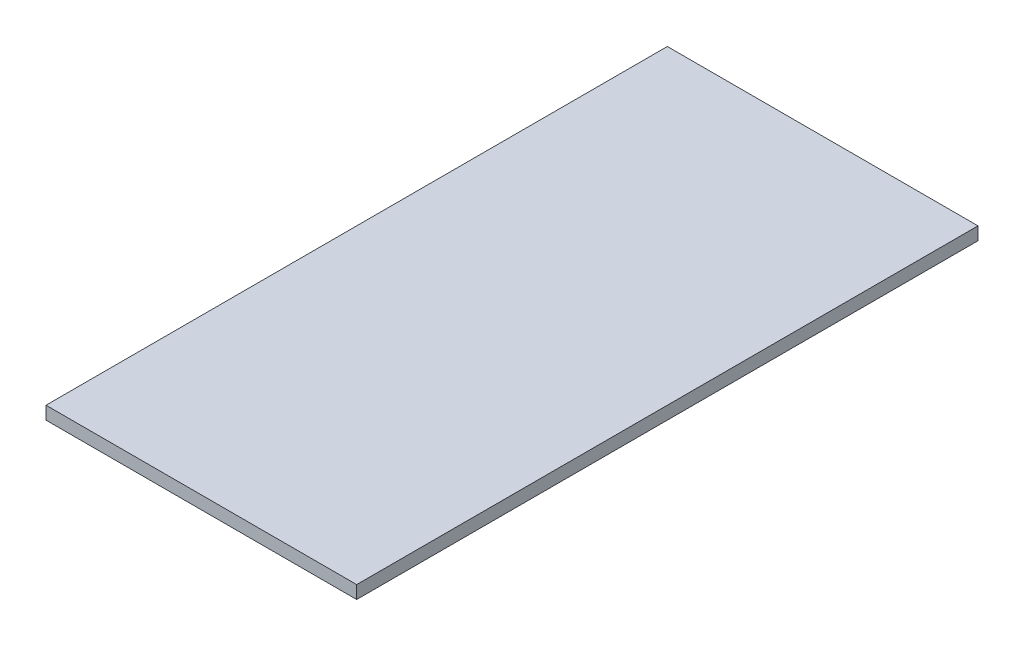
ISO-10303-21;
HEADER;
FILE_DESCRIPTION(('STEP AP214'),'2;1');
FILE_NAME('part.step','',(''),(''),'','','');
FILE_SCHEMA(('AUTOMOTIVE_DESIGN { 1 0 10303 214 1 1 1 1 }'));
ENDSEC;
DATA;
#1=APPLICATION_CONTEXT('core data for automotive mechanical design processes');
#2=APPLICATION_PROTOCOL_DEFINITION('international standard','automotive_design',2000,#1);
#3=PRODUCT_CONTEXT('',#1,'mechanical');
#4=PRODUCT('Part','Part','',(#3));
#5=PRODUCT_RELATED_PRODUCT_CATEGORY('part','',(#4));
#6=PRODUCT_DEFINITION_FORMATION('','',#4);
#7=PRODUCT_DEFINITION_CONTEXT('part definition',#1,'design');
#8=PRODUCT_DEFINITION('design','',#6,#7);
#9=PRODUCT_DEFINITION_SHAPE('','',#8);
#10=(LENGTH_UNIT() NAMED_UNIT(*) SI_UNIT(.MILLI.,.METRE.));
#11=(NAMED_UNIT(*) PLANE_ANGLE_UNIT() SI_UNIT($,.RADIAN.));
#12=(NAMED_UNIT(*) SI_UNIT($,.STERADIAN.) SOLID_ANGLE_UNIT());
#13=UNCERTAINTY_MEASURE_WITH_UNIT(LENGTH_MEASURE(1.E-05),#10,'distance_accuracy_value','');
#14=(GEOMETRIC_REPRESENTATION_CONTEXT(3) GLOBAL_UNCERTAINTY_ASSIGNED_CONTEXT((#13)) GLOBAL_UNIT_ASSIGNED_CONTEXT((#10,
#11,#12)) REPRESENTATION_CONTEXT('',''));
#15=CARTESIAN_POINT('',(0.,0.,0.));
#16=DIRECTION('',(0.,0.,1.));
#17=DIRECTION('',(1.,0.,0.));
#18=AXIS2_PLACEMENT_3D('',#15,#16,#17);
#19=CARTESIAN_POINT('',(0.,3.175,0.));
#20=DIRECTION('',(1.,0.,0.));
#21=DIRECTION('',(0.,0.,-1.));
#22=AXIS2_PLACEMENT_3D('',#19,#20,#21);
#23=PLANE('',#22);
#24=DIRECTION('',(0.,0.,1.));
#25=VECTOR('',#24,1.);
#26=CARTESIAN_POINT('',(0.,0.,0.));
#27=LINE('',#26,#25);
#28=CARTESIAN_POINT('',(0.,0.,-152.4));
#29=VERTEX_POINT('',#28);
#30=CARTESIAN_POINT('',(0.,0.,0.));
#31=VERTEX_POINT('',#30);
#32=EDGE_CURVE('E98',#29,#31,#27,.T.);
#33=ORIENTED_EDGE('',*,*,#32,.T.);
#34=DIRECTION('',(0.,-1.,0.));
#35=VECTOR('',#34,1.);
#36=CARTESIAN_POINT('',(0.,3.175,0.));
#37=LINE('',#36,#35);
#38=CARTESIAN_POINT('',(0.,3.175,0.));
#39=VERTEX_POINT('',#38);
#40=EDGE_CURVE('E11',#39,#31,#37,.T.);
#41=ORIENTED_EDGE('',*,*,#40,.F.);
#42=DIRECTION('',(0.,0.,1.));
#43=VECTOR('',#42,1.);
#44=CARTESIAN_POINT('',(0.,3.175,0.));
#45=LINE('',#44,#43);
#46=CARTESIAN_POINT('',(0.,3.175,-152.4));
#47=VERTEX_POINT('',#46);
#48=EDGE_CURVE('E86',#47,#39,#45,.T.);
#49=ORIENTED_EDGE('',*,*,#48,.F.);
#50=DIRECTION('',(0.,-1.,0.));
#51=VECTOR('',#50,1.);
#52=CARTESIAN_POINT('',(0.,3.175,-152.4));
#53=LINE('',#52,#51);
#54=EDGE_CURVE('E94',#47,#29,#53,.T.);
#55=ORIENTED_EDGE('',*,*,#54,.T.);
#56=EDGE_LOOP('',(#33,#41,#49,#55));
#57=FACE_BOUND('',#56,.T.);
#58=ADVANCED_FACE('F35',(#57),#23,.F.);
#59=CARTESIAN_POINT('',(0.,3.175,0.));
#60=DIRECTION('',(0.,0.,-1.));
#61=DIRECTION('',(-1.,0.,0.));
#62=AXIS2_PLACEMENT_3D('',#59,#60,#61);
#63=PLANE('',#62);
#64=DIRECTION('',(1.,0.,0.));
#65=VECTOR('',#64,1.);
#66=CARTESIAN_POINT('',(0.,0.,0.));
#67=LINE('',#66,#65);
#68=CARTESIAN_POINT('',(76.2,0.,0.));
#69=VERTEX_POINT('',#68);
#70=EDGE_CURVE('E90',#31,#69,#67,.T.);
#71=ORIENTED_EDGE('',*,*,#70,.T.);
#72=DIRECTION('',(0.,-1.,0.));
#73=VECTOR('',#72,1.);
#74=CARTESIAN_POINT('',(76.2,3.175,0.));
#75=LINE('',#74,#73);
#76=CARTESIAN_POINT('',(76.2,3.175,0.));
#77=VERTEX_POINT('',#76);
#78=EDGE_CURVE('E43',#77,#69,#75,.T.);
#79=ORIENTED_EDGE('',*,*,#78,.F.);
#80=DIRECTION('',(1.,0.,0.));
#81=VECTOR('',#80,1.);
#82=CARTESIAN_POINT('',(0.,3.175,0.));
#83=LINE('',#82,#81);
#84=EDGE_CURVE('E81',#39,#77,#83,.T.);
#85=ORIENTED_EDGE('',*,*,#84,.F.);
#86=ORIENTED_EDGE('',*,*,#40,.T.);
#87=EDGE_LOOP('',(#71,#79,#85,#86));
#88=FACE_BOUND('',#87,.T.);
#89=ADVANCED_FACE('F89',(#88),#63,.F.);
#90=CARTESIAN_POINT('',(76.2,3.175,0.));
#91=DIRECTION('',(-1.,0.,0.));
#92=DIRECTION('',(0.,0.,1.));
#93=AXIS2_PLACEMENT_3D('',#90,#91,#92);
#94=PLANE('',#93);
#95=DIRECTION('',(0.,0.,-1.));
#96=VECTOR('',#95,1.);
#97=CARTESIAN_POINT('',(76.2,0.,0.));
#98=LINE('',#97,#96);
#99=CARTESIAN_POINT('',(76.2,0.,-152.4));
#100=VERTEX_POINT('',#99);
#101=EDGE_CURVE('E68',#69,#100,#98,.T.);
#102=ORIENTED_EDGE('',*,*,#101,.T.);
#103=DIRECTION('',(0.,-1.,0.));
#104=VECTOR('',#103,1.);
#105=CARTESIAN_POINT('',(76.2,3.175,-152.4));
#106=LINE('',#105,#104);
#107=CARTESIAN_POINT('',(76.2,3.175,-152.4));
#108=VERTEX_POINT('',#107);
#109=EDGE_CURVE('E91',#108,#100,#106,.T.);
#110=ORIENTED_EDGE('',*,*,#109,.F.);
#111=DIRECTION('',(0.,0.,-1.));
#112=VECTOR('',#111,1.);
#113=CARTESIAN_POINT('',(76.2,3.175,0.));
#114=LINE('',#113,#112);
#115=EDGE_CURVE('E84',#77,#108,#114,.T.);
#116=ORIENTED_EDGE('',*,*,#115,.F.);
#117=ORIENTED_EDGE('',*,*,#78,.T.);
#118=EDGE_LOOP('',(#102,#110,#116,#117));
#119=FACE_BOUND('',#118,.T.);
#120=ADVANCED_FACE('F92',(#119),#94,.F.);
#121=CARTESIAN_POINT('',(0.,3.175,-152.4));
#122=DIRECTION('',(0.,0.,1.));
#123=DIRECTION('',(1.,0.,0.));
#124=AXIS2_PLACEMENT_3D('',#121,#122,#123);
#125=PLANE('',#124);
#126=DIRECTION('',(-1.,0.,0.));
#127=VECTOR('',#126,1.);
#128=CARTESIAN_POINT('',(0.,0.,-152.4));
#129=LINE('',#128,#127);
#130=EDGE_CURVE('E74',#100,#29,#129,.T.);
#131=ORIENTED_EDGE('',*,*,#130,.T.);
#132=ORIENTED_EDGE('',*,*,#54,.F.);
#133=DIRECTION('',(-1.,0.,0.));
#134=VECTOR('',#133,1.);
#135=CARTESIAN_POINT('',(0.,3.175,-152.4));
#136=LINE('',#135,#134);
#137=EDGE_CURVE('E51',#108,#47,#136,.T.);
#138=ORIENTED_EDGE('',*,*,#137,.F.);
#139=ORIENTED_EDGE('',*,*,#109,.T.);
#140=EDGE_LOOP('',(#131,#132,#138,#139));
#141=FACE_BOUND('',#140,.T.);
#142=ADVANCED_FACE('F105',(#141),#125,.F.);
#143=CARTESIAN_POINT('',(0.,3.175,0.));
#144=DIRECTION('',(0.,-1.,0.));
#145=DIRECTION('',(0.,0.,-1.));
#146=AXIS2_PLACEMENT_3D('',#143,#144,#145);
#147=PLANE('',#146);
#148=ORIENTED_EDGE('',*,*,#48,.T.);
#149=ORIENTED_EDGE('',*,*,#84,.T.);
#150=ORIENTED_EDGE('',*,*,#115,.T.);
#151=ORIENTED_EDGE('',*,*,#137,.T.);
#152=EDGE_LOOP('',(#148,#149,#150,#151));
#153=FACE_BOUND('',#152,.T.);
#154=ADVANCED_FACE('F82',(#153),#147,.F.);
#155=CARTESIAN_POINT('',(0.,0.,0.));
#156=DIRECTION('',(0.,-1.,0.));
#157=DIRECTION('',(0.,0.,-1.));
#158=AXIS2_PLACEMENT_3D('',#155,#156,#157);
#159=PLANE('',#158);
#160=ORIENTED_EDGE('',*,*,#32,.F.);
#161=ORIENTED_EDGE('',*,*,#130,.F.);
#162=ORIENTED_EDGE('',*,*,#101,.F.);
#163=ORIENTED_EDGE('',*,*,#70,.F.);
#164=EDGE_LOOP('',(#160,#161,#162,#163));
#165=FACE_BOUND('',#164,.T.);
#166=ADVANCED_FACE('F108',(#165),#159,.T.);
#167=CLOSED_SHELL('',(#58,#89,#120,#142,#154,#166));
#168=MANIFOLD_SOLID_BREP('B2',#167);
#169=ADVANCED_BREP_SHAPE_REPRESENTATION('',(#18,#168),#14);
#170=SHAPE_DEFINITION_REPRESENTATION(#9,#169);
ENDSEC;
END-ISO-10303-21;
